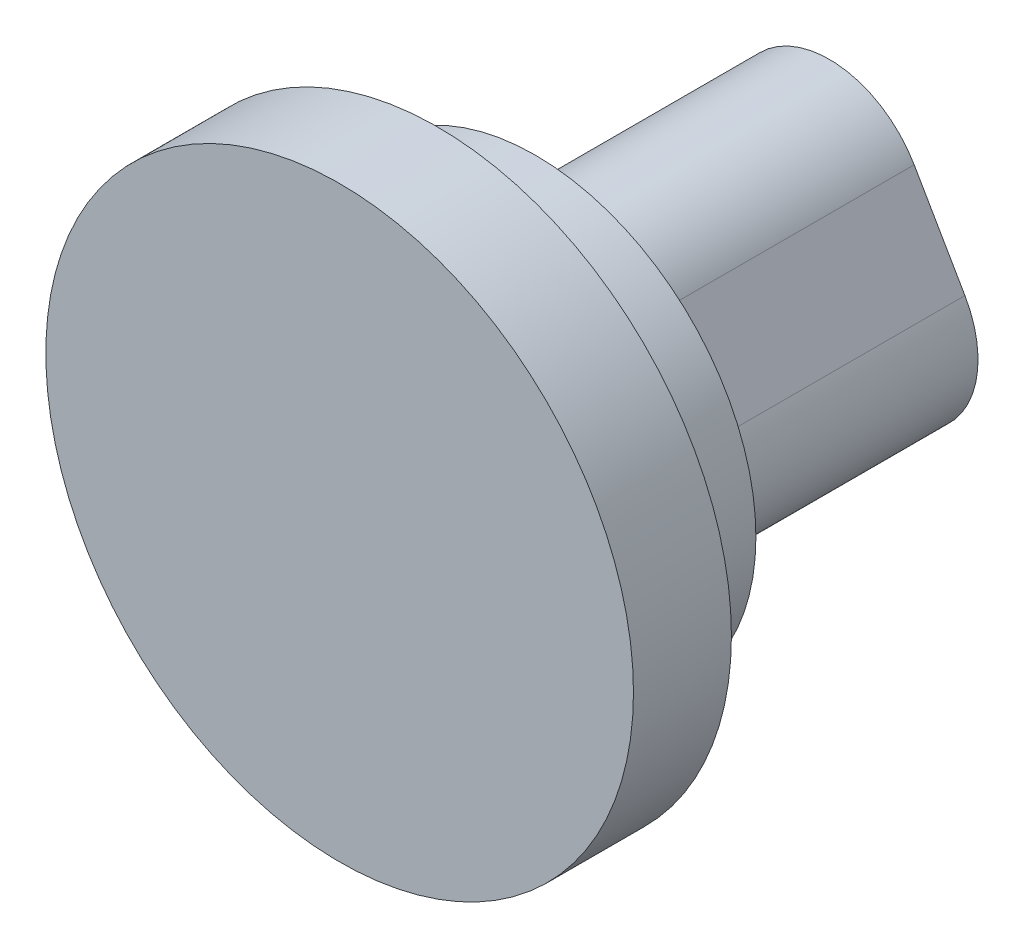
ISO-10303-21;
HEADER;
FILE_DESCRIPTION(('STEP AP214'),'2;1');
FILE_NAME('part.step','',(''),(''),'','','');
FILE_SCHEMA(('AUTOMOTIVE_DESIGN { 1 0 10303 214 1 1 1 1 }'));
ENDSEC;
DATA;
#1=APPLICATION_CONTEXT('core data for automotive mechanical design processes');
#2=APPLICATION_PROTOCOL_DEFINITION('international standard','automotive_design',2000,#1);
#3=PRODUCT_CONTEXT('',#1,'mechanical');
#4=PRODUCT('Part','Part','',(#3));
#5=PRODUCT_RELATED_PRODUCT_CATEGORY('part','',(#4));
#6=PRODUCT_DEFINITION_FORMATION('','',#4);
#7=PRODUCT_DEFINITION_CONTEXT('part definition',#1,'design');
#8=PRODUCT_DEFINITION('design','',#6,#7);
#9=PRODUCT_DEFINITION_SHAPE('','',#8);
#10=(LENGTH_UNIT() NAMED_UNIT(*) SI_UNIT(.MILLI.,.METRE.));
#11=(NAMED_UNIT(*) PLANE_ANGLE_UNIT() SI_UNIT($,.RADIAN.));
#12=(NAMED_UNIT(*) SI_UNIT($,.STERADIAN.) SOLID_ANGLE_UNIT());
#13=UNCERTAINTY_MEASURE_WITH_UNIT(LENGTH_MEASURE(1.E-05),#10,'distance_accuracy_value','');
#14=(GEOMETRIC_REPRESENTATION_CONTEXT(3) GLOBAL_UNCERTAINTY_ASSIGNED_CONTEXT((#13)) GLOBAL_UNIT_ASSIGNED_CONTEXT((#10,
#11,#12)) REPRESENTATION_CONTEXT('',''));
#15=CARTESIAN_POINT('',(0.,0.,0.));
#16=DIRECTION('',(0.,0.,1.));
#17=DIRECTION('',(1.,0.,0.));
#18=AXIS2_PLACEMENT_3D('',#15,#16,#17);
#19=CARTESIAN_POINT('',(2.25,3.89711431702997,3.));
#20=DIRECTION('',(0.866025403784439,-0.5,0.));
#21=DIRECTION('',(0.5,0.866025403784439,0.));
#22=AXIS2_PLACEMENT_3D('',#19,#20,#21);
#23=PLANE('',#22);
#24=DIRECTION('',(-0.5,-0.866025403784439,0.));
#25=VECTOR('',#24,1.);
#26=CARTESIAN_POINT('',(2.25,3.89711431702997,0.));
#27=LINE('',#26,#25);
#28=CARTESIAN_POINT('',(1.38397459621556,2.39711431702997,0.));
#29=VERTEX_POINT('',#28);
#30=CARTESIAN_POINT('',(0.866025403784438,1.5,0.));
#31=VERTEX_POINT('',#30);
#32=EDGE_CURVE('E128',#29,#31,#27,.T.);
#33=ORIENTED_EDGE('',*,*,#32,.T.);
#34=DIRECTION('',(0.,0.,-1.));
#35=VECTOR('',#34,1.);
#36=CARTESIAN_POINT('',(0.866025403784438,1.5,3.));
#37=LINE('',#36,#35);
#38=CARTESIAN_POINT('',(0.866025403784438,1.5,3.));
#39=VERTEX_POINT('',#38);
#40=EDGE_CURVE('E106',#31,#39,#37,.F.);
#41=ORIENTED_EDGE('',*,*,#40,.T.);
#42=DIRECTION('',(-0.5,-0.866025403784439,0.));
#43=VECTOR('',#42,1.);
#44=CARTESIAN_POINT('',(2.25,3.89711431702997,3.));
#45=LINE('',#44,#43);
#46=CARTESIAN_POINT('',(1.38397459621556,2.39711431702997,3.));
#47=VERTEX_POINT('',#46);
#48=EDGE_CURVE('E97',#47,#39,#45,.T.);
#49=ORIENTED_EDGE('',*,*,#48,.F.);
#50=DIRECTION('',(0.,0.,-1.));
#51=VECTOR('',#50,1.);
#52=CARTESIAN_POINT('',(1.38397459621556,2.39711431702997,3.));
#53=LINE('',#52,#51);
#54=EDGE_CURVE('E104',#47,#29,#53,.T.);
#55=ORIENTED_EDGE('',*,*,#54,.T.);
#56=EDGE_LOOP('',(#33,#41,#49,#55));
#57=FACE_BOUND('',#56,.T.);
#58=ADVANCED_FACE('F33',(#57),#23,.F.);
#59=CARTESIAN_POINT('',(0.,0.,3.));
#60=DIRECTION('',(0.,1.,0.));
#61=DIRECTION('',(0.,0.,1.));
#62=AXIS2_PLACEMENT_3D('',#59,#60,#61);
#63=PLANE('',#62);
#64=DIRECTION('',(1.,0.,0.));
#65=VECTOR('',#64,1.);
#66=CARTESIAN_POINT('',(0.,0.,3.));
#67=LINE('',#66,#65);
#68=CARTESIAN_POINT('',(1.73205080756888,0.,3.));
#69=VERTEX_POINT('',#68);
#70=CARTESIAN_POINT('',(2.76794919243112,0.,3.));
#71=VERTEX_POINT('',#70);
#72=EDGE_CURVE('E107',#69,#71,#67,.T.);
#73=ORIENTED_EDGE('',*,*,#72,.F.);
#74=DIRECTION('',(0.,0.,-1.));
#75=VECTOR('',#74,1.);
#76=CARTESIAN_POINT('',(1.73205080756888,0.,3.));
#77=LINE('',#76,#75);
#78=CARTESIAN_POINT('',(1.73205080756888,0.,0.));
#79=VERTEX_POINT('',#78);
#80=EDGE_CURVE('E133',#69,#79,#77,.T.);
#81=ORIENTED_EDGE('',*,*,#80,.T.);
#82=DIRECTION('',(1.,0.,0.));
#83=VECTOR('',#82,1.);
#84=CARTESIAN_POINT('',(0.,0.,0.));
#85=LINE('',#84,#83);
#86=CARTESIAN_POINT('',(2.76794919243112,0.,0.));
#87=VERTEX_POINT('',#86);
#88=EDGE_CURVE('E126',#79,#87,#85,.T.);
#89=ORIENTED_EDGE('',*,*,#88,.T.);
#90=DIRECTION('',(0.,0.,-1.));
#91=VECTOR('',#90,1.);
#92=CARTESIAN_POINT('',(2.76794919243112,0.,3.));
#93=LINE('',#92,#91);
#94=EDGE_CURVE('E69',#87,#71,#93,.F.);
#95=ORIENTED_EDGE('',*,*,#94,.T.);
#96=EDGE_LOOP('',(#73,#81,#89,#95));
#97=FACE_BOUND('',#96,.T.);
#98=ADVANCED_FACE('F137',(#97),#63,.F.);
#99=CARTESIAN_POINT('',(4.5,0.,3.));
#100=DIRECTION('',(-0.866025403784439,-0.5,0.));
#101=DIRECTION('',(0.5,-0.866025403784439,0.));
#102=AXIS2_PLACEMENT_3D('',#99,#100,#101);
#103=PLANE('',#102);
#104=DIRECTION('',(-0.5,0.866025403784438,0.));
#105=VECTOR('',#104,1.);
#106=CARTESIAN_POINT('',(4.5,0.,3.));
#107=LINE('',#106,#105);
#108=CARTESIAN_POINT('',(3.63397459621556,1.5,3.));
#109=VERTEX_POINT('',#108);
#110=CARTESIAN_POINT('',(3.11602540378444,2.39711431702997,3.));
#111=VERTEX_POINT('',#110);
#112=EDGE_CURVE('E98',#109,#111,#107,.T.);
#113=ORIENTED_EDGE('',*,*,#112,.F.);
#114=DIRECTION('',(0.,0.,-1.));
#115=VECTOR('',#114,1.);
#116=CARTESIAN_POINT('',(3.63397459621556,1.5,3.));
#117=LINE('',#116,#115);
#118=CARTESIAN_POINT('',(3.63397459621556,1.5,0.));
#119=VERTEX_POINT('',#118);
#120=EDGE_CURVE('E118',#109,#119,#117,.T.);
#121=ORIENTED_EDGE('',*,*,#120,.T.);
#122=DIRECTION('',(-0.5,0.866025403784438,0.));
#123=VECTOR('',#122,1.);
#124=CARTESIAN_POINT('',(4.5,0.,0.));
#125=LINE('',#124,#123);
#126=CARTESIAN_POINT('',(3.11602540378444,2.39711431702997,0.));
#127=VERTEX_POINT('',#126);
#128=EDGE_CURVE('E108',#119,#127,#125,.T.);
#129=ORIENTED_EDGE('',*,*,#128,.T.);
#130=DIRECTION('',(0.,0.,-1.));
#131=VECTOR('',#130,1.);
#132=CARTESIAN_POINT('',(3.11602540378444,2.39711431702998,3.));
#133=LINE('',#132,#131);
#134=EDGE_CURVE('E48',#127,#111,#133,.F.);
#135=ORIENTED_EDGE('',*,*,#134,.T.);
#136=EDGE_LOOP('',(#113,#121,#129,#135));
#137=FACE_BOUND('',#136,.T.);
#138=ADVANCED_FACE('F122',(#137),#103,.F.);
#139=CARTESIAN_POINT('',(0.,0.,0.));
#140=DIRECTION('',(0.,0.,1.));
#141=DIRECTION('',(1.,0.,0.));
#142=AXIS2_PLACEMENT_3D('',#139,#140,#141);
#143=PLANE('',#142);
#144=ORIENTED_EDGE('',*,*,#88,.F.);
#145=CARTESIAN_POINT('',(1.73205080756888,1.,0.));
#146=DIRECTION('',(0.,0.,1.));
#147=DIRECTION('',(1.,0.,0.));
#148=AXIS2_PLACEMENT_3D('',#145,#146,#147);
#149=CIRCLE('',#148,1.);
#150=EDGE_CURVE('E110',#79,#31,#149,.F.);
#151=ORIENTED_EDGE('',*,*,#150,.T.);
#152=ORIENTED_EDGE('',*,*,#32,.F.);
#153=CARTESIAN_POINT('',(2.25,1.89711431702997,0.));
#154=DIRECTION('',(0.,0.,1.));
#155=DIRECTION('',(1.,0.,0.));
#156=AXIS2_PLACEMENT_3D('',#153,#154,#155);
#157=CIRCLE('',#156,1.);
#158=EDGE_CURVE('E93',#29,#127,#157,.F.);
#159=ORIENTED_EDGE('',*,*,#158,.T.);
#160=ORIENTED_EDGE('',*,*,#128,.F.);
#161=CARTESIAN_POINT('',(2.76794919243112,1.,0.));
#162=DIRECTION('',(0.,0.,1.));
#163=DIRECTION('',(1.,0.,0.));
#164=AXIS2_PLACEMENT_3D('',#161,#162,#163);
#165=CIRCLE('',#164,1.);
#166=EDGE_CURVE('E113',#119,#87,#165,.F.);
#167=ORIENTED_EDGE('',*,*,#166,.T.);
#168=EDGE_LOOP('',(#144,#151,#152,#159,#160,#167));
#169=FACE_BOUND('',#168,.T.);
#170=ADVANCED_FACE('F125',(#169),#143,.F.);
#171=CARTESIAN_POINT('',(2.25,1.29903810567666,3.));
#172=DIRECTION('',(0.,0.,1.));
#173=DIRECTION('',(1.,0.,0.));
#174=AXIS2_PLACEMENT_3D('',#171,#172,#173);
#175=PLANE('',#174);
#176=CARTESIAN_POINT('',(2.25,1.29903810567666,3.));
#177=DIRECTION('',(0.,0.,1.));
#178=DIRECTION('',(1.,0.,0.));
#179=AXIS2_PLACEMENT_3D('',#176,#177,#178);
#180=CIRCLE('',#179,2.25);
#181=CARTESIAN_POINT('',(4.5,1.29903810567666,3.));
#182=VERTEX_POINT('',#181);
#183=EDGE_CURVE('E182',#182,#182,#180,.T.);
#184=ORIENTED_EDGE('',*,*,#183,.F.);
#185=EDGE_LOOP('',(#184));
#186=FACE_BOUND('',#185,.T.);
#187=ORIENTED_EDGE('',*,*,#112,.T.);
#188=CARTESIAN_POINT('',(2.25,1.89711431702997,3.));
#189=DIRECTION('',(0.,0.,1.));
#190=DIRECTION('',(1.,0.,0.));
#191=AXIS2_PLACEMENT_3D('',#188,#189,#190);
#192=CIRCLE('',#191,1.);
#193=EDGE_CURVE('E11',#111,#47,#192,.T.);
#194=ORIENTED_EDGE('',*,*,#193,.T.);
#195=ORIENTED_EDGE('',*,*,#48,.T.);
#196=CARTESIAN_POINT('',(1.73205080756888,1.,3.));
#197=DIRECTION('',(0.,0.,1.));
#198=DIRECTION('',(1.,0.,0.));
#199=AXIS2_PLACEMENT_3D('',#196,#197,#198);
#200=CIRCLE('',#199,1.);
#201=EDGE_CURVE('E78',#39,#69,#200,.T.);
#202=ORIENTED_EDGE('',*,*,#201,.T.);
#203=ORIENTED_EDGE('',*,*,#72,.T.);
#204=CARTESIAN_POINT('',(2.76794919243112,1.,3.));
#205=DIRECTION('',(0.,0.,1.));
#206=DIRECTION('',(1.,0.,0.));
#207=AXIS2_PLACEMENT_3D('',#204,#205,#206);
#208=CIRCLE('',#207,1.);
#209=EDGE_CURVE('E41',#71,#109,#208,.T.);
#210=ORIENTED_EDGE('',*,*,#209,.T.);
#211=EDGE_LOOP('',(#187,#194,#195,#202,#203,#210));
#212=FACE_BOUND('',#211,.T.);
#213=ADVANCED_FACE('F96',(#186,#212),#175,.F.);
#214=CARTESIAN_POINT('',(2.25,1.29903810567666,4.));
#215=DIRECTION('',(0.,0.,-1.));
#216=DIRECTION('',(-1.,0.,0.));
#217=AXIS2_PLACEMENT_3D('',#214,#215,#216);
#218=CYLINDRICAL_SURFACE('',#217,2.25);
#219=CARTESIAN_POINT('',(2.25,1.29903810567666,4.));
#220=DIRECTION('',(0.,0.,1.));
#221=DIRECTION('',(1.,0.,0.));
#222=AXIS2_PLACEMENT_3D('',#219,#220,#221);
#223=CIRCLE('',#222,2.25);
#224=CARTESIAN_POINT('',(4.5,1.29903810567666,4.));
#225=VERTEX_POINT('',#224);
#226=EDGE_CURVE('E140',#225,#225,#223,.T.);
#227=ORIENTED_EDGE('',*,*,#226,.F.);
#228=EDGE_LOOP('',(#227));
#229=FACE_BOUND('',#228,.T.);
#230=ORIENTED_EDGE('',*,*,#183,.T.);
#231=EDGE_LOOP('',(#230));
#232=FACE_BOUND('',#231,.T.);
#233=ADVANCED_FACE('F164',(#229,#232),#218,.T.);
#234=CARTESIAN_POINT('',(2.25,1.29903810567666,5.));
#235=DIRECTION('',(0.,0.,-1.));
#236=DIRECTION('',(-1.,0.,0.));
#237=AXIS2_PLACEMENT_3D('',#234,#235,#236);
#238=CYLINDRICAL_SURFACE('',#237,3.);
#239=CARTESIAN_POINT('',(2.25,1.29903810567666,5.));
#240=DIRECTION('',(0.,0.,1.));
#241=DIRECTION('',(1.,0.,0.));
#242=AXIS2_PLACEMENT_3D('',#239,#240,#241);
#243=CIRCLE('',#242,3.);
#244=CARTESIAN_POINT('',(5.25,1.29903810567666,5.));
#245=VERTEX_POINT('',#244);
#246=EDGE_CURVE('E181',#245,#245,#243,.T.);
#247=ORIENTED_EDGE('',*,*,#246,.F.);
#248=EDGE_LOOP('',(#247));
#249=FACE_BOUND('',#248,.T.);
#250=CARTESIAN_POINT('',(2.25,1.29903810567666,4.));
#251=DIRECTION('',(0.,0.,1.));
#252=DIRECTION('',(1.,0.,0.));
#253=AXIS2_PLACEMENT_3D('',#250,#251,#252);
#254=CIRCLE('',#253,3.);
#255=CARTESIAN_POINT('',(5.25,1.29903810567666,4.));
#256=VERTEX_POINT('',#255);
#257=EDGE_CURVE('E183',#256,#256,#254,.T.);
#258=ORIENTED_EDGE('',*,*,#257,.T.);
#259=EDGE_LOOP('',(#258));
#260=FACE_BOUND('',#259,.T.);
#261=ADVANCED_FACE('F167',(#249,#260),#238,.T.);
#262=CARTESIAN_POINT('',(2.25,1.29903810567666,5.));
#263=DIRECTION('',(0.,0.,1.));
#264=DIRECTION('',(1.,0.,0.));
#265=AXIS2_PLACEMENT_3D('',#262,#263,#264);
#266=PLANE('',#265);
#267=ORIENTED_EDGE('',*,*,#246,.T.);
#268=EDGE_LOOP('',(#267));
#269=FACE_BOUND('',#268,.T.);
#270=ADVANCED_FACE('F150',(#269),#266,.T.);
#271=CARTESIAN_POINT('',(2.25,1.29903810567666,4.));
#272=DIRECTION('',(0.,0.,1.));
#273=DIRECTION('',(1.,0.,0.));
#274=AXIS2_PLACEMENT_3D('',#271,#272,#273);
#275=PLANE('',#274);
#276=ORIENTED_EDGE('',*,*,#226,.T.);
#277=EDGE_LOOP('',(#276));
#278=FACE_BOUND('',#277,.T.);
#279=ORIENTED_EDGE('',*,*,#257,.F.);
#280=EDGE_LOOP('',(#279));
#281=FACE_BOUND('',#280,.T.);
#282=ADVANCED_FACE('F144',(#278,#281),#275,.F.);
#283=CARTESIAN_POINT('',(1.73205080756888,1.,3.));
#284=DIRECTION('',(0.,0.,-1.));
#285=DIRECTION('',(-1.,0.,0.));
#286=AXIS2_PLACEMENT_3D('',#283,#284,#285);
#287=CYLINDRICAL_SURFACE('',#286,1.);
#288=ORIENTED_EDGE('',*,*,#201,.F.);
#289=ORIENTED_EDGE('',*,*,#40,.F.);
#290=ORIENTED_EDGE('',*,*,#150,.F.);
#291=ORIENTED_EDGE('',*,*,#80,.F.);
#292=EDGE_LOOP('',(#288,#289,#290,#291));
#293=FACE_BOUND('',#292,.T.);
#294=ADVANCED_FACE('F141',(#293),#287,.T.);
#295=CARTESIAN_POINT('',(2.76794919243112,1.,3.));
#296=DIRECTION('',(0.,0.,-1.));
#297=DIRECTION('',(-1.,0.,0.));
#298=AXIS2_PLACEMENT_3D('',#295,#296,#297);
#299=CYLINDRICAL_SURFACE('',#298,1.);
#300=ORIENTED_EDGE('',*,*,#209,.F.);
#301=ORIENTED_EDGE('',*,*,#94,.F.);
#302=ORIENTED_EDGE('',*,*,#166,.F.);
#303=ORIENTED_EDGE('',*,*,#120,.F.);
#304=EDGE_LOOP('',(#300,#301,#302,#303));
#305=FACE_BOUND('',#304,.T.);
#306=ADVANCED_FACE('F143',(#305),#299,.T.);
#307=CARTESIAN_POINT('',(2.25,1.89711431702997,3.));
#308=DIRECTION('',(0.,0.,-1.));
#309=DIRECTION('',(-1.,0.,0.));
#310=AXIS2_PLACEMENT_3D('',#307,#308,#309);
#311=CYLINDRICAL_SURFACE('',#310,1.);
#312=ORIENTED_EDGE('',*,*,#193,.F.);
#313=ORIENTED_EDGE('',*,*,#134,.F.);
#314=ORIENTED_EDGE('',*,*,#158,.F.);
#315=ORIENTED_EDGE('',*,*,#54,.F.);
#316=EDGE_LOOP('',(#312,#313,#314,#315));
#317=FACE_BOUND('',#316,.T.);
#318=ADVANCED_FACE('F35',(#317),#311,.T.);
#319=CLOSED_SHELL('',(#58,#98,#138,#170,#213,#233,#261,#270,#282,#294,#306,#318));
#320=MANIFOLD_SOLID_BREP('B2',#319);
#321=ADVANCED_BREP_SHAPE_REPRESENTATION('',(#18,#320),#14);
#322=SHAPE_DEFINITION_REPRESENTATION(#9,#321);
ENDSEC;
END-ISO-10303-21;
